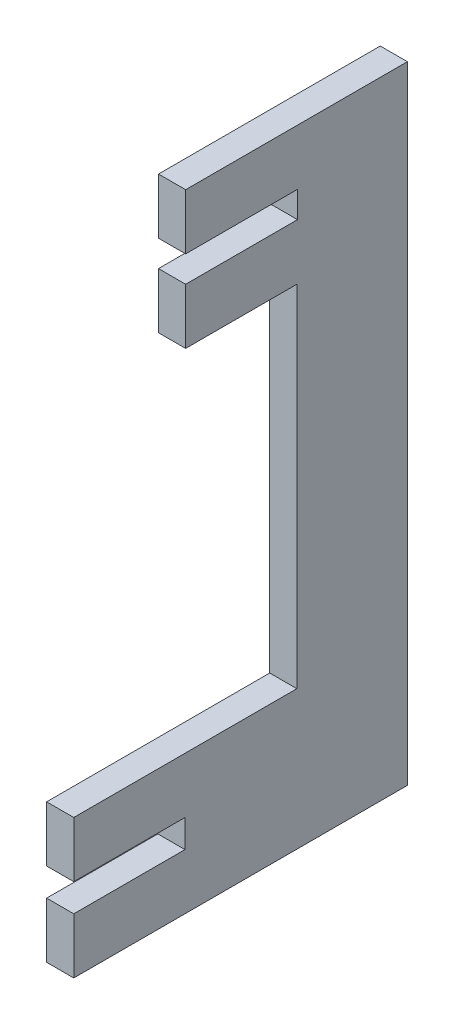
ISO-10303-21;
HEADER;
FILE_DESCRIPTION(('STEP AP214'),'2;1');
FILE_NAME('part.step','',(''),(''),'','','');
FILE_SCHEMA(('AUTOMOTIVE_DESIGN { 1 0 10303 214 1 1 1 1 }'));
ENDSEC;
DATA;
#1=APPLICATION_CONTEXT('core data for automotive mechanical design processes');
#2=APPLICATION_PROTOCOL_DEFINITION('international standard','automotive_design',2000,#1);
#3=PRODUCT_CONTEXT('',#1,'mechanical');
#4=PRODUCT('Part','Part','',(#3));
#5=PRODUCT_RELATED_PRODUCT_CATEGORY('part','',(#4));
#6=PRODUCT_DEFINITION_FORMATION('','',#4);
#7=PRODUCT_DEFINITION_CONTEXT('part definition',#1,'design');
#8=PRODUCT_DEFINITION('design','',#6,#7);
#9=PRODUCT_DEFINITION_SHAPE('','',#8);
#10=(LENGTH_UNIT() NAMED_UNIT(*) SI_UNIT(.MILLI.,.METRE.));
#11=(NAMED_UNIT(*) PLANE_ANGLE_UNIT() SI_UNIT($,.RADIAN.));
#12=(NAMED_UNIT(*) SI_UNIT($,.STERADIAN.) SOLID_ANGLE_UNIT());
#13=UNCERTAINTY_MEASURE_WITH_UNIT(LENGTH_MEASURE(1.E-05),#10,'distance_accuracy_value','');
#14=(GEOMETRIC_REPRESENTATION_CONTEXT(3) GLOBAL_UNCERTAINTY_ASSIGNED_CONTEXT((#13)) GLOBAL_UNIT_ASSIGNED_CONTEXT((#10,
#11,#12)) REPRESENTATION_CONTEXT('',''));
#15=CARTESIAN_POINT('',(0.,0.,0.));
#16=DIRECTION('',(0.,0.,1.));
#17=DIRECTION('',(1.,0.,0.));
#18=AXIS2_PLACEMENT_3D('',#15,#16,#17);
#19=CARTESIAN_POINT('',(3.0988,1.5875,12.7));
#20=DIRECTION('',(0.,0.,-1.));
#21=DIRECTION('',(0.,1.,0.));
#22=AXIS2_PLACEMENT_3D('',#19,#20,#21);
#23=PLANE('',#22);
#24=DIRECTION('',(0.,-1.,0.));
#25=VECTOR('',#24,1.);
#26=CARTESIAN_POINT('',(0.,1.5875,12.7));
#27=LINE('',#26,#25);
#28=CARTESIAN_POINT('',(0.,7.9375,12.7));
#29=VERTEX_POINT('',#28);
#30=CARTESIAN_POINT('',(0.,1.5875,12.7));
#31=VERTEX_POINT('',#30);
#32=EDGE_CURVE('E188',#29,#31,#27,.T.);
#33=ORIENTED_EDGE('',*,*,#32,.T.);
#34=DIRECTION('',(-1.,0.,0.));
#35=VECTOR('',#34,1.);
#36=CARTESIAN_POINT('',(3.0988,1.5875,12.7));
#37=LINE('',#36,#35);
#38=CARTESIAN_POINT('',(3.0988,1.5875,12.7));
#39=VERTEX_POINT('',#38);
#40=EDGE_CURVE('E11',#39,#31,#37,.T.);
#41=ORIENTED_EDGE('',*,*,#40,.F.);
#42=DIRECTION('',(0.,-1.,0.));
#43=VECTOR('',#42,1.);
#44=CARTESIAN_POINT('',(3.0988,1.5875,12.7));
#45=LINE('',#44,#43);
#46=CARTESIAN_POINT('',(3.0988,7.9375,12.7));
#47=VERTEX_POINT('',#46);
#48=EDGE_CURVE('E234',#47,#39,#45,.T.);
#49=ORIENTED_EDGE('',*,*,#48,.F.);
#50=DIRECTION('',(-1.,0.,0.));
#51=VECTOR('',#50,1.);
#52=CARTESIAN_POINT('',(3.0988,7.9375,12.7));
#53=LINE('',#52,#51);
#54=EDGE_CURVE('E184',#47,#29,#53,.T.);
#55=ORIENTED_EDGE('',*,*,#54,.T.);
#56=EDGE_LOOP('',(#33,#41,#49,#55));
#57=FACE_BOUND('',#56,.T.);
#58=ADVANCED_FACE('F39',(#57),#23,.F.);
#59=CARTESIAN_POINT('',(3.0988,1.5875,12.7));
#60=DIRECTION('',(0.,1.,0.));
#61=DIRECTION('',(0.,0.,1.));
#62=AXIS2_PLACEMENT_3D('',#59,#60,#61);
#63=PLANE('',#62);
#64=DIRECTION('',(0.,0.,-1.));
#65=VECTOR('',#64,1.);
#66=CARTESIAN_POINT('',(0.,1.5875,12.7));
#67=LINE('',#66,#65);
#68=CARTESIAN_POINT('',(0.,1.5875,0.));
#69=VERTEX_POINT('',#68);
#70=EDGE_CURVE('E192',#31,#69,#67,.T.);
#71=ORIENTED_EDGE('',*,*,#70,.T.);
#72=DIRECTION('',(-1.,0.,0.));
#73=VECTOR('',#72,1.);
#74=CARTESIAN_POINT('',(3.0988,1.5875,0.));
#75=LINE('',#74,#73);
#76=CARTESIAN_POINT('',(3.0988,1.5875,0.));
#77=VERTEX_POINT('',#76);
#78=EDGE_CURVE('E48',#77,#69,#75,.T.);
#79=ORIENTED_EDGE('',*,*,#78,.F.);
#80=DIRECTION('',(0.,0.,-1.));
#81=VECTOR('',#80,1.);
#82=CARTESIAN_POINT('',(3.0988,1.5875,12.7));
#83=LINE('',#82,#81);
#84=EDGE_CURVE('E123',#39,#77,#83,.T.);
#85=ORIENTED_EDGE('',*,*,#84,.F.);
#86=ORIENTED_EDGE('',*,*,#40,.T.);
#87=EDGE_LOOP('',(#71,#79,#85,#86));
#88=FACE_BOUND('',#87,.T.);
#89=ADVANCED_FACE('F356',(#88),#63,.F.);
#90=CARTESIAN_POINT('',(3.0988,1.5875,0.));
#91=DIRECTION('',(0.,0.,-1.));
#92=DIRECTION('',(0.,1.,0.));
#93=AXIS2_PLACEMENT_3D('',#90,#91,#92);
#94=PLANE('',#93);
#95=DIRECTION('',(0.,-1.,0.));
#96=VECTOR('',#95,1.);
#97=CARTESIAN_POINT('',(0.,1.5875,0.));
#98=LINE('',#97,#96);
#99=CARTESIAN_POINT('',(0.,-1.5875,0.));
#100=VERTEX_POINT('',#99);
#101=EDGE_CURVE('E195',#69,#100,#98,.T.);
#102=ORIENTED_EDGE('',*,*,#101,.T.);
#103=DIRECTION('',(-1.,0.,0.));
#104=VECTOR('',#103,1.);
#105=CARTESIAN_POINT('',(3.0988,-1.5875,0.));
#106=LINE('',#105,#104);
#107=CARTESIAN_POINT('',(3.0988,-1.5875,0.));
#108=VERTEX_POINT('',#107);
#109=EDGE_CURVE('E277',#108,#100,#106,.T.);
#110=ORIENTED_EDGE('',*,*,#109,.F.);
#111=DIRECTION('',(0.,-1.,0.));
#112=VECTOR('',#111,1.);
#113=CARTESIAN_POINT('',(3.0988,1.5875,0.));
#114=LINE('',#113,#112);
#115=EDGE_CURVE('E287',#77,#108,#114,.T.);
#116=ORIENTED_EDGE('',*,*,#115,.F.);
#117=ORIENTED_EDGE('',*,*,#78,.T.);
#118=EDGE_LOOP('',(#102,#110,#116,#117));
#119=FACE_BOUND('',#118,.T.);
#120=ADVANCED_FACE('F285',(#119),#94,.F.);
#121=CARTESIAN_POINT('',(3.0988,-1.5875,12.7));
#122=DIRECTION('',(0.,-1.,0.));
#123=DIRECTION('',(0.,0.,-1.));
#124=AXIS2_PLACEMENT_3D('',#121,#122,#123);
#125=PLANE('',#124);
#126=DIRECTION('',(0.,0.,1.));
#127=VECTOR('',#126,1.);
#128=CARTESIAN_POINT('',(0.,-1.5875,12.7));
#129=LINE('',#128,#127);
#130=CARTESIAN_POINT('',(0.,-1.5875,12.7));
#131=VERTEX_POINT('',#130);
#132=EDGE_CURVE('E198',#100,#131,#129,.T.);
#133=ORIENTED_EDGE('',*,*,#132,.T.);
#134=DIRECTION('',(-1.,0.,0.));
#135=VECTOR('',#134,1.);
#136=CARTESIAN_POINT('',(3.0988,-1.5875,12.7));
#137=LINE('',#136,#135);
#138=CARTESIAN_POINT('',(3.0988,-1.5875,12.7));
#139=VERTEX_POINT('',#138);
#140=EDGE_CURVE('E273',#139,#131,#137,.T.);
#141=ORIENTED_EDGE('',*,*,#140,.F.);
#142=DIRECTION('',(0.,0.,1.));
#143=VECTOR('',#142,1.);
#144=CARTESIAN_POINT('',(3.0988,-1.5875,12.7));
#145=LINE('',#144,#143);
#146=EDGE_CURVE('E306',#108,#139,#145,.T.);
#147=ORIENTED_EDGE('',*,*,#146,.F.);
#148=ORIENTED_EDGE('',*,*,#109,.T.);
#149=EDGE_LOOP('',(#133,#141,#147,#148));
#150=FACE_BOUND('',#149,.T.);
#151=ADVANCED_FACE('F296',(#150),#125,.F.);
#152=CARTESIAN_POINT('',(3.0988,-1.5875,12.7));
#153=DIRECTION('',(0.,0.,-1.));
#154=DIRECTION('',(-1.,0.,0.));
#155=AXIS2_PLACEMENT_3D('',#152,#153,#154);
#156=PLANE('',#155);
#157=DIRECTION('',(0.,-1.,0.));
#158=VECTOR('',#157,1.);
#159=CARTESIAN_POINT('',(0.,-1.5875,12.7));
#160=LINE('',#159,#158);
#161=CARTESIAN_POINT('',(0.,-7.9375,12.7));
#162=VERTEX_POINT('',#161);
#163=EDGE_CURVE('E201',#131,#162,#160,.T.);
#164=ORIENTED_EDGE('',*,*,#163,.T.);
#165=DIRECTION('',(-1.,0.,0.));
#166=VECTOR('',#165,1.);
#167=CARTESIAN_POINT('',(3.0988,-7.9375,12.7));
#168=LINE('',#167,#166);
#169=CARTESIAN_POINT('',(3.0988,-7.9375,12.7));
#170=VERTEX_POINT('',#169);
#171=EDGE_CURVE('E269',#170,#162,#168,.T.);
#172=ORIENTED_EDGE('',*,*,#171,.F.);
#173=DIRECTION('',(0.,-1.,0.));
#174=VECTOR('',#173,1.);
#175=CARTESIAN_POINT('',(3.0988,-1.5875,12.7));
#176=LINE('',#175,#174);
#177=EDGE_CURVE('E302',#139,#170,#176,.T.);
#178=ORIENTED_EDGE('',*,*,#177,.F.);
#179=ORIENTED_EDGE('',*,*,#140,.T.);
#180=EDGE_LOOP('',(#164,#172,#178,#179));
#181=FACE_BOUND('',#180,.T.);
#182=ADVANCED_FACE('F300',(#181),#156,.F.);
#183=CARTESIAN_POINT('',(3.0988,-7.9375,12.7));
#184=DIRECTION('',(0.,1.,0.));
#185=DIRECTION('',(0.,0.,1.));
#186=AXIS2_PLACEMENT_3D('',#183,#184,#185);
#187=PLANE('',#186);
#188=DIRECTION('',(0.,0.,-1.));
#189=VECTOR('',#188,1.);
#190=CARTESIAN_POINT('',(0.,-7.9375,12.7));
#191=LINE('',#190,#189);
#192=CARTESIAN_POINT('',(0.,-7.9375,-25.4));
#193=VERTEX_POINT('',#192);
#194=EDGE_CURVE('E204',#162,#193,#191,.T.);
#195=ORIENTED_EDGE('',*,*,#194,.T.);
#196=DIRECTION('',(-1.,0.,0.));
#197=VECTOR('',#196,1.);
#198=CARTESIAN_POINT('',(3.0988,-7.9375,-25.4));
#199=LINE('',#198,#197);
#200=CARTESIAN_POINT('',(3.0988,-7.9375,-25.4));
#201=VERTEX_POINT('',#200);
#202=EDGE_CURVE('E265',#201,#193,#199,.T.);
#203=ORIENTED_EDGE('',*,*,#202,.F.);
#204=DIRECTION('',(0.,0.,-1.));
#205=VECTOR('',#204,1.);
#206=CARTESIAN_POINT('',(3.0988,-7.9375,12.7));
#207=LINE('',#206,#205);
#208=EDGE_CURVE('E305',#170,#201,#207,.T.);
#209=ORIENTED_EDGE('',*,*,#208,.F.);
#210=ORIENTED_EDGE('',*,*,#171,.T.);
#211=EDGE_LOOP('',(#195,#203,#209,#210));
#212=FACE_BOUND('',#211,.T.);
#213=ADVANCED_FACE('F369',(#212),#187,.F.);
#214=CARTESIAN_POINT('',(3.0988,-7.9375,-25.4));
#215=DIRECTION('',(0.,0.,1.));
#216=DIRECTION('',(0.,-1.,0.));
#217=AXIS2_PLACEMENT_3D('',#214,#215,#216);
#218=PLANE('',#217);
#219=DIRECTION('',(0.,1.,0.));
#220=VECTOR('',#219,1.);
#221=CARTESIAN_POINT('',(0.,-7.9375,-25.4));
#222=LINE('',#221,#220);
#223=CARTESIAN_POINT('',(0.,63.637500096,-25.4));
#224=VERTEX_POINT('',#223);
#225=EDGE_CURVE('E207',#193,#224,#222,.T.);
#226=ORIENTED_EDGE('',*,*,#225,.T.);
#227=DIRECTION('',(-1.,0.,0.));
#228=VECTOR('',#227,1.);
#229=CARTESIAN_POINT('',(3.0988,63.637500096,-25.4));
#230=LINE('',#229,#228);
#231=CARTESIAN_POINT('',(3.0988,63.637500096,-25.4));
#232=VERTEX_POINT('',#231);
#233=EDGE_CURVE('E261',#232,#224,#230,.T.);
#234=ORIENTED_EDGE('',*,*,#233,.F.);
#235=DIRECTION('',(0.,1.,0.));
#236=VECTOR('',#235,1.);
#237=CARTESIAN_POINT('',(3.0988,-7.9375,-25.4));
#238=LINE('',#237,#236);
#239=EDGE_CURVE('E310',#201,#232,#238,.T.);
#240=ORIENTED_EDGE('',*,*,#239,.F.);
#241=ORIENTED_EDGE('',*,*,#202,.T.);
#242=EDGE_LOOP('',(#226,#234,#240,#241));
#243=FACE_BOUND('',#242,.T.);
#244=ADVANCED_FACE('F372',(#243),#218,.F.);
#245=CARTESIAN_POINT('',(3.0988,63.637500096,-25.4));
#246=DIRECTION('',(0.,-1.,0.));
#247=DIRECTION('',(0.,0.,-1.));
#248=AXIS2_PLACEMENT_3D('',#245,#246,#247);
#249=PLANE('',#248);
#250=DIRECTION('',(0.,0.,1.));
#251=VECTOR('',#250,1.);
#252=CARTESIAN_POINT('',(0.,63.637500096,-25.4));
#253=LINE('',#252,#251);
#254=CARTESIAN_POINT('',(0.,63.637500096,-0.0761999999999799));
#255=VERTEX_POINT('',#254);
#256=EDGE_CURVE('E210',#224,#255,#253,.T.);
#257=ORIENTED_EDGE('',*,*,#256,.T.);
#258=DIRECTION('',(-1.,0.,0.));
#259=VECTOR('',#258,1.);
#260=CARTESIAN_POINT('',(3.0988,63.637500096,-0.0761999999999799));
#261=LINE('',#260,#259);
#262=CARTESIAN_POINT('',(3.0988,63.637500096,-0.0761999999999799));
#263=VERTEX_POINT('',#262);
#264=EDGE_CURVE('E257',#263,#255,#261,.T.);
#265=ORIENTED_EDGE('',*,*,#264,.F.);
#266=DIRECTION('',(0.,0.,1.));
#267=VECTOR('',#266,1.);
#268=CARTESIAN_POINT('',(3.0988,63.637500096,-25.4));
#269=LINE('',#268,#267);
#270=EDGE_CURVE('E317',#232,#263,#269,.T.);
#271=ORIENTED_EDGE('',*,*,#270,.F.);
#272=ORIENTED_EDGE('',*,*,#233,.T.);
#273=EDGE_LOOP('',(#257,#265,#271,#272));
#274=FACE_BOUND('',#273,.T.);
#275=ADVANCED_FACE('F376',(#274),#249,.F.);
#276=CARTESIAN_POINT('',(3.0988,63.637500096,-0.0761999999999799));
#277=DIRECTION('',(0.,0.,-1.));
#278=DIRECTION('',(0.,1.,0.));
#279=AXIS2_PLACEMENT_3D('',#276,#277,#278);
#280=PLANE('',#279);
#281=DIRECTION('',(0.,-1.,0.));
#282=VECTOR('',#281,1.);
#283=CARTESIAN_POINT('',(0.,63.637500096,-0.0761999999999799));
#284=LINE('',#283,#282);
#285=CARTESIAN_POINT('',(0.,57.287500096,-0.0761999999999819));
#286=VERTEX_POINT('',#285);
#287=EDGE_CURVE('E213',#255,#286,#284,.T.);
#288=ORIENTED_EDGE('',*,*,#287,.T.);
#289=DIRECTION('',(-1.,0.,0.));
#290=VECTOR('',#289,1.);
#291=CARTESIAN_POINT('',(3.0988,57.287500096,-0.0761999999999819));
#292=LINE('',#291,#290);
#293=CARTESIAN_POINT('',(3.0988,57.287500096,-0.0761999999999819));
#294=VERTEX_POINT('',#293);
#295=EDGE_CURVE('E253',#294,#286,#292,.T.);
#296=ORIENTED_EDGE('',*,*,#295,.F.);
#297=DIRECTION('',(0.,-1.,0.));
#298=VECTOR('',#297,1.);
#299=CARTESIAN_POINT('',(3.0988,63.637500096,-0.0761999999999799));
#300=LINE('',#299,#298);
#301=EDGE_CURVE('E320',#263,#294,#300,.T.);
#302=ORIENTED_EDGE('',*,*,#301,.F.);
#303=ORIENTED_EDGE('',*,*,#264,.T.);
#304=EDGE_LOOP('',(#288,#296,#302,#303));
#305=FACE_BOUND('',#304,.T.);
#306=ADVANCED_FACE('F380',(#305),#280,.F.);
#307=CARTESIAN_POINT('',(3.0988,57.287500096,-0.0761999999999819));
#308=DIRECTION('',(0.,1.,0.));
#309=DIRECTION('',(0.,0.,1.));
#310=AXIS2_PLACEMENT_3D('',#307,#308,#309);
#311=PLANE('',#310);
#312=DIRECTION('',(0.,0.,-1.));
#313=VECTOR('',#312,1.);
#314=CARTESIAN_POINT('',(0.,57.287500096,-0.0761999999999819));
#315=LINE('',#314,#313);
#316=CARTESIAN_POINT('',(0.,57.287500096,-12.8524));
#317=VERTEX_POINT('',#316);
#318=EDGE_CURVE('E216',#286,#317,#315,.T.);
#319=ORIENTED_EDGE('',*,*,#318,.T.);
#320=DIRECTION('',(-1.,0.,0.));
#321=VECTOR('',#320,1.);
#322=CARTESIAN_POINT('',(3.0988,57.287500096,-12.8524));
#323=LINE('',#322,#321);
#324=CARTESIAN_POINT('',(3.0988,57.287500096,-12.8524));
#325=VERTEX_POINT('',#324);
#326=EDGE_CURVE('E249',#325,#317,#323,.T.);
#327=ORIENTED_EDGE('',*,*,#326,.F.);
#328=DIRECTION('',(0.,0.,-1.));
#329=VECTOR('',#328,1.);
#330=CARTESIAN_POINT('',(3.0988,57.287500096,-0.0761999999999819));
#331=LINE('',#330,#329);
#332=EDGE_CURVE('E323',#294,#325,#331,.T.);
#333=ORIENTED_EDGE('',*,*,#332,.F.);
#334=ORIENTED_EDGE('',*,*,#295,.T.);
#335=EDGE_LOOP('',(#319,#327,#333,#334));
#336=FACE_BOUND('',#335,.T.);
#337=ADVANCED_FACE('F384',(#336),#311,.F.);
#338=CARTESIAN_POINT('',(3.0988,57.287500096,-12.8524));
#339=DIRECTION('',(0.,0.,-1.));
#340=DIRECTION('',(0.,1.,0.));
#341=AXIS2_PLACEMENT_3D('',#338,#339,#340);
#342=PLANE('',#341);
#343=DIRECTION('',(0.,-1.,0.));
#344=VECTOR('',#343,1.);
#345=CARTESIAN_POINT('',(0.,57.287500096,-12.8524));
#346=LINE('',#345,#344);
#347=CARTESIAN_POINT('',(0.,54.2875,-12.8524));
#348=VERTEX_POINT('',#347);
#349=EDGE_CURVE('E219',#317,#348,#346,.T.);
#350=ORIENTED_EDGE('',*,*,#349,.T.);
#351=DIRECTION('',(-1.,0.,0.));
#352=VECTOR('',#351,1.);
#353=CARTESIAN_POINT('',(3.0988,54.2875,-12.8524));
#354=LINE('',#353,#352);
#355=CARTESIAN_POINT('',(3.0988,54.2875,-12.8524));
#356=VERTEX_POINT('',#355);
#357=EDGE_CURVE('E245',#356,#348,#354,.T.);
#358=ORIENTED_EDGE('',*,*,#357,.F.);
#359=DIRECTION('',(0.,-1.,0.));
#360=VECTOR('',#359,1.);
#361=CARTESIAN_POINT('',(3.0988,57.287500096,-12.8524));
#362=LINE('',#361,#360);
#363=EDGE_CURVE('E326',#325,#356,#362,.T.);
#364=ORIENTED_EDGE('',*,*,#363,.F.);
#365=ORIENTED_EDGE('',*,*,#326,.T.);
#366=EDGE_LOOP('',(#350,#358,#364,#365));
#367=FACE_BOUND('',#366,.T.);
#368=ADVANCED_FACE('F388',(#367),#342,.F.);
#369=CARTESIAN_POINT('',(3.0988,54.2875,-12.8524));
#370=DIRECTION('',(0.,-1.,0.));
#371=DIRECTION('',(0.,0.,-1.));
#372=AXIS2_PLACEMENT_3D('',#369,#370,#371);
#373=PLANE('',#372);
#374=DIRECTION('',(0.,0.,1.));
#375=VECTOR('',#374,1.);
#376=CARTESIAN_POINT('',(0.,54.2875,-12.8524));
#377=LINE('',#376,#375);
#378=CARTESIAN_POINT('',(0.,54.2875,-0.0761999999999817));
#379=VERTEX_POINT('',#378);
#380=EDGE_CURVE('E222',#348,#379,#377,.T.);
#381=ORIENTED_EDGE('',*,*,#380,.T.);
#382=DIRECTION('',(-1.,0.,0.));
#383=VECTOR('',#382,1.);
#384=CARTESIAN_POINT('',(3.0988,54.2875,-0.0761999999999817));
#385=LINE('',#384,#383);
#386=CARTESIAN_POINT('',(3.0988,54.2875,-0.0761999999999817));
#387=VERTEX_POINT('',#386);
#388=EDGE_CURVE('E241',#387,#379,#385,.T.);
#389=ORIENTED_EDGE('',*,*,#388,.F.);
#390=DIRECTION('',(0.,0.,1.));
#391=VECTOR('',#390,1.);
#392=CARTESIAN_POINT('',(3.0988,54.2875,-12.8524));
#393=LINE('',#392,#391);
#394=EDGE_CURVE('E329',#356,#387,#393,.T.);
#395=ORIENTED_EDGE('',*,*,#394,.F.);
#396=ORIENTED_EDGE('',*,*,#357,.T.);
#397=EDGE_LOOP('',(#381,#389,#395,#396));
#398=FACE_BOUND('',#397,.T.);
#399=ADVANCED_FACE('F337',(#398),#373,.F.);
#400=CARTESIAN_POINT('',(3.0988,54.2875,-0.0761999999999817));
#401=DIRECTION('',(0.,0.,-1.));
#402=DIRECTION('',(0.,1.,0.));
#403=AXIS2_PLACEMENT_3D('',#400,#401,#402);
#404=PLANE('',#403);
#405=DIRECTION('',(0.,-1.,0.));
#406=VECTOR('',#405,1.);
#407=CARTESIAN_POINT('',(0.,54.2875,-0.0761999999999817));
#408=LINE('',#407,#406);
#409=CARTESIAN_POINT('',(0.,47.9375,-0.0761999999999837));
#410=VERTEX_POINT('',#409);
#411=EDGE_CURVE('E225',#379,#410,#408,.T.);
#412=ORIENTED_EDGE('',*,*,#411,.T.);
#413=DIRECTION('',(-1.,0.,0.));
#414=VECTOR('',#413,1.);
#415=CARTESIAN_POINT('',(3.0988,47.9375,-0.0761999999999837));
#416=LINE('',#415,#414);
#417=CARTESIAN_POINT('',(3.0988,47.9375,-0.0761999999999837));
#418=VERTEX_POINT('',#417);
#419=EDGE_CURVE('E177',#418,#410,#416,.T.);
#420=ORIENTED_EDGE('',*,*,#419,.F.);
#421=DIRECTION('',(0.,-1.,0.));
#422=VECTOR('',#421,1.);
#423=CARTESIAN_POINT('',(3.0988,54.2875,-0.0761999999999817));
#424=LINE('',#423,#422);
#425=EDGE_CURVE('E166',#387,#418,#424,.T.);
#426=ORIENTED_EDGE('',*,*,#425,.F.);
#427=ORIENTED_EDGE('',*,*,#388,.T.);
#428=EDGE_LOOP('',(#412,#420,#426,#427));
#429=FACE_BOUND('',#428,.T.);
#430=ADVANCED_FACE('F341',(#429),#404,.F.);
#431=CARTESIAN_POINT('',(3.0988,47.9375,-12.7762));
#432=DIRECTION('',(0.,1.,0.));
#433=DIRECTION('',(0.,0.,1.));
#434=AXIS2_PLACEMENT_3D('',#431,#432,#433);
#435=PLANE('',#434);
#436=DIRECTION('',(0.,0.,-1.));
#437=VECTOR('',#436,1.);
#438=CARTESIAN_POINT('',(0.,47.9375,-12.7762));
#439=LINE('',#438,#437);
#440=CARTESIAN_POINT('',(0.,47.9375,-12.7762));
#441=VERTEX_POINT('',#440);
#442=EDGE_CURVE('E175',#410,#441,#439,.T.);
#443=ORIENTED_EDGE('',*,*,#442,.T.);
#444=DIRECTION('',(-1.,0.,0.));
#445=VECTOR('',#444,1.);
#446=CARTESIAN_POINT('',(3.0988,47.9375,-12.7762));
#447=LINE('',#446,#445);
#448=CARTESIAN_POINT('',(3.0988,47.9375,-12.7762));
#449=VERTEX_POINT('',#448);
#450=EDGE_CURVE('E172',#449,#441,#447,.T.);
#451=ORIENTED_EDGE('',*,*,#450,.F.);
#452=DIRECTION('',(0.,0.,-1.));
#453=VECTOR('',#452,1.);
#454=CARTESIAN_POINT('',(3.0988,47.9375,-12.7762));
#455=LINE('',#454,#453);
#456=EDGE_CURVE('E160',#418,#449,#455,.T.);
#457=ORIENTED_EDGE('',*,*,#456,.F.);
#458=ORIENTED_EDGE('',*,*,#419,.T.);
#459=EDGE_LOOP('',(#443,#451,#457,#458));
#460=FACE_BOUND('',#459,.T.);
#461=ADVANCED_FACE('F173',(#460),#435,.F.);
#462=CARTESIAN_POINT('',(3.0988,7.9375,-12.7762));
#463=DIRECTION('',(0.,0.,-1.));
#464=DIRECTION('',(0.,1.,0.));
#465=AXIS2_PLACEMENT_3D('',#462,#463,#464);
#466=PLANE('',#465);
#467=DIRECTION('',(0.,-1.,0.));
#468=VECTOR('',#467,1.);
#469=CARTESIAN_POINT('',(0.,7.9375,-12.7762));
#470=LINE('',#469,#468);
#471=CARTESIAN_POINT('',(0.,7.9375,-12.7762));
#472=VERTEX_POINT('',#471);
#473=EDGE_CURVE('E109',#441,#472,#470,.T.);
#474=ORIENTED_EDGE('',*,*,#473,.T.);
#475=DIRECTION('',(-1.,0.,0.));
#476=VECTOR('',#475,1.);
#477=CARTESIAN_POINT('',(3.0988,7.9375,-12.7762));
#478=LINE('',#477,#476);
#479=CARTESIAN_POINT('',(3.0988,7.9375,-12.7762));
#480=VERTEX_POINT('',#479);
#481=EDGE_CURVE('E178',#480,#472,#478,.T.);
#482=ORIENTED_EDGE('',*,*,#481,.F.);
#483=DIRECTION('',(0.,-1.,0.));
#484=VECTOR('',#483,1.);
#485=CARTESIAN_POINT('',(3.0988,7.9375,-12.7762));
#486=LINE('',#485,#484);
#487=EDGE_CURVE('E164',#449,#480,#486,.T.);
#488=ORIENTED_EDGE('',*,*,#487,.F.);
#489=ORIENTED_EDGE('',*,*,#450,.T.);
#490=EDGE_LOOP('',(#474,#482,#488,#489));
#491=FACE_BOUND('',#490,.T.);
#492=ADVANCED_FACE('F180',(#491),#466,.F.);
#493=CARTESIAN_POINT('',(3.0988,7.9375,12.7));
#494=DIRECTION('',(0.,-1.,0.));
#495=DIRECTION('',(0.,0.,-1.));
#496=AXIS2_PLACEMENT_3D('',#493,#494,#495);
#497=PLANE('',#496);
#498=DIRECTION('',(0.,0.,1.));
#499=VECTOR('',#498,1.);
#500=CARTESIAN_POINT('',(0.,7.9375,12.7));
#501=LINE('',#500,#499);
#502=EDGE_CURVE('E115',#472,#29,#501,.T.);
#503=ORIENTED_EDGE('',*,*,#502,.T.);
#504=ORIENTED_EDGE('',*,*,#54,.F.);
#505=DIRECTION('',(0.,0.,1.));
#506=VECTOR('',#505,1.);
#507=CARTESIAN_POINT('',(3.0988,7.9375,12.7));
#508=LINE('',#507,#506);
#509=EDGE_CURVE('E56',#480,#47,#508,.T.);
#510=ORIENTED_EDGE('',*,*,#509,.F.);
#511=ORIENTED_EDGE('',*,*,#481,.T.);
#512=EDGE_LOOP('',(#503,#504,#510,#511));
#513=FACE_BOUND('',#512,.T.);
#514=ADVANCED_FACE('F345',(#513),#497,.F.);
#515=CARTESIAN_POINT('',(3.0988,0.,0.));
#516=DIRECTION('',(-1.,0.,0.));
#517=DIRECTION('',(0.,0.,1.));
#518=AXIS2_PLACEMENT_3D('',#515,#516,#517);
#519=PLANE('',#518);
#520=ORIENTED_EDGE('',*,*,#48,.T.);
#521=ORIENTED_EDGE('',*,*,#84,.T.);
#522=ORIENTED_EDGE('',*,*,#115,.T.);
#523=ORIENTED_EDGE('',*,*,#146,.T.);
#524=ORIENTED_EDGE('',*,*,#177,.T.);
#525=ORIENTED_EDGE('',*,*,#208,.T.);
#526=ORIENTED_EDGE('',*,*,#239,.T.);
#527=ORIENTED_EDGE('',*,*,#270,.T.);
#528=ORIENTED_EDGE('',*,*,#301,.T.);
#529=ORIENTED_EDGE('',*,*,#332,.T.);
#530=ORIENTED_EDGE('',*,*,#363,.T.);
#531=ORIENTED_EDGE('',*,*,#394,.T.);
#532=ORIENTED_EDGE('',*,*,#425,.T.);
#533=ORIENTED_EDGE('',*,*,#456,.T.);
#534=ORIENTED_EDGE('',*,*,#487,.T.);
#535=ORIENTED_EDGE('',*,*,#509,.T.);
#536=EDGE_LOOP('',(#520,#521,#522,#523,#524,#525,#526,#527,#528,#529,#530,#531,#532,#533,#534,#535));
#537=FACE_BOUND('',#536,.T.);
#538=ADVANCED_FACE('F162',(#537),#519,.F.);
#539=CARTESIAN_POINT('',(0.,0.,0.));
#540=DIRECTION('',(-1.,0.,0.));
#541=DIRECTION('',(0.,0.,1.));
#542=AXIS2_PLACEMENT_3D('',#539,#540,#541);
#543=PLANE('',#542);
#544=ORIENTED_EDGE('',*,*,#32,.F.);
#545=ORIENTED_EDGE('',*,*,#502,.F.);
#546=ORIENTED_EDGE('',*,*,#473,.F.);
#547=ORIENTED_EDGE('',*,*,#442,.F.);
#548=ORIENTED_EDGE('',*,*,#411,.F.);
#549=ORIENTED_EDGE('',*,*,#380,.F.);
#550=ORIENTED_EDGE('',*,*,#349,.F.);
#551=ORIENTED_EDGE('',*,*,#318,.F.);
#552=ORIENTED_EDGE('',*,*,#287,.F.);
#553=ORIENTED_EDGE('',*,*,#256,.F.);
#554=ORIENTED_EDGE('',*,*,#225,.F.);
#555=ORIENTED_EDGE('',*,*,#194,.F.);
#556=ORIENTED_EDGE('',*,*,#163,.F.);
#557=ORIENTED_EDGE('',*,*,#132,.F.);
#558=ORIENTED_EDGE('',*,*,#101,.F.);
#559=ORIENTED_EDGE('',*,*,#70,.F.);
#560=EDGE_LOOP('',(#544,#545,#546,#547,#548,#549,#550,#551,#552,#553,#554,#555,#556,#557,#558,#559));
#561=FACE_BOUND('',#560,.T.);
#562=ADVANCED_FACE('F291',(#561),#543,.T.);
#563=CLOSED_SHELL('',(#58,#89,#120,#151,#182,#213,#244,#275,#306,#337,#368,#399,#430,#461,#492,
#514,#538,#562));
#564=MANIFOLD_SOLID_BREP('B2',#563);
#565=ADVANCED_BREP_SHAPE_REPRESENTATION('',(#18,#564),#14);
#566=SHAPE_DEFINITION_REPRESENTATION(#9,#565);
ENDSEC;
END-ISO-10303-21;
